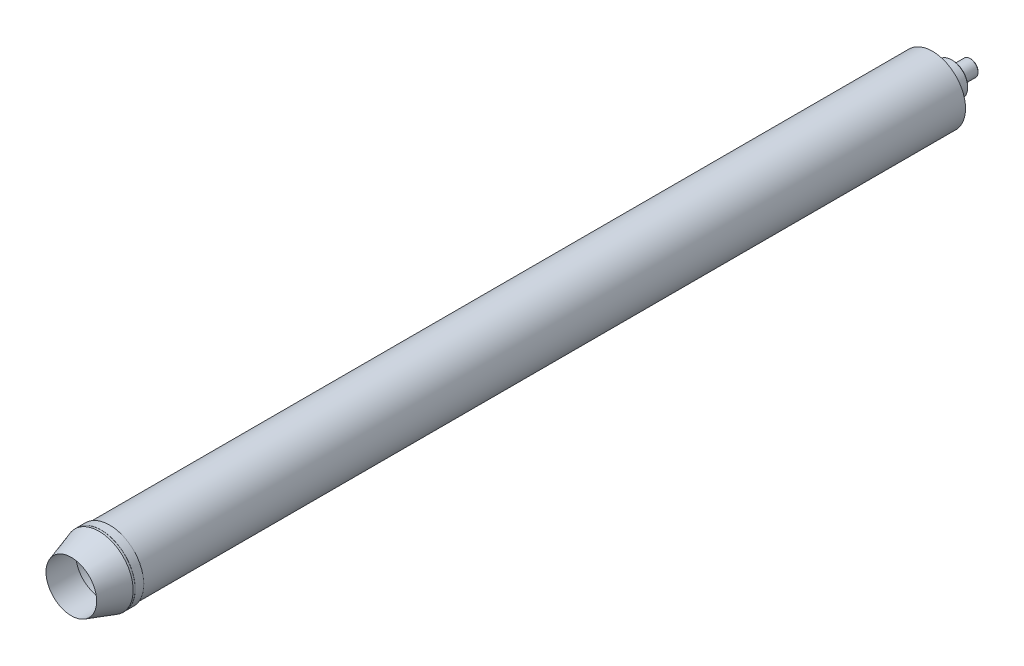
ISO-10303-21;
HEADER;
FILE_DESCRIPTION(('STEP AP214'),'2;1');
FILE_NAME('part.step','',(''),(''),'','','');
FILE_SCHEMA(('AUTOMOTIVE_DESIGN { 1 0 10303 214 1 1 1 1 }'));
ENDSEC;
DATA;
#1=APPLICATION_CONTEXT('core data for automotive mechanical design processes');
#2=APPLICATION_PROTOCOL_DEFINITION('international standard','automotive_design',2000,#1);
#3=PRODUCT_CONTEXT('',#1,'mechanical');
#4=PRODUCT('Part','Part','',(#3));
#5=PRODUCT_RELATED_PRODUCT_CATEGORY('part','',(#4));
#6=PRODUCT_DEFINITION_FORMATION('','',#4);
#7=PRODUCT_DEFINITION_CONTEXT('part definition',#1,'design');
#8=PRODUCT_DEFINITION('design','',#6,#7);
#9=PRODUCT_DEFINITION_SHAPE('','',#8);
#10=(LENGTH_UNIT() NAMED_UNIT(*) SI_UNIT(.MILLI.,.METRE.));
#11=(NAMED_UNIT(*) PLANE_ANGLE_UNIT() SI_UNIT($,.RADIAN.));
#12=(NAMED_UNIT(*) SI_UNIT($,.STERADIAN.) SOLID_ANGLE_UNIT());
#13=UNCERTAINTY_MEASURE_WITH_UNIT(LENGTH_MEASURE(1.E-05),#10,'distance_accuracy_value','');
#14=(GEOMETRIC_REPRESENTATION_CONTEXT(3) GLOBAL_UNCERTAINTY_ASSIGNED_CONTEXT((#13)) GLOBAL_UNIT_ASSIGNED_CONTEXT((#10,
#11,#12)) REPRESENTATION_CONTEXT('',''));
#15=CARTESIAN_POINT('',(0.,0.,0.));
#16=DIRECTION('',(0.,0.,1.));
#17=DIRECTION('',(1.,0.,0.));
#18=AXIS2_PLACEMENT_3D('',#15,#16,#17);
#19=CARTESIAN_POINT('',(0.,0.,-29.845));
#20=DIRECTION('',(0.,0.,-1.));
#21=DIRECTION('',(-1.,0.,0.));
#22=AXIS2_PLACEMENT_3D('',#19,#20,#21);
#23=PLANE('',#22);
#24=CARTESIAN_POINT('',(0.,0.,-29.845));
#25=DIRECTION('',(0.,0.,-1.));
#26=DIRECTION('',(-1.,0.,0.));
#27=AXIS2_PLACEMENT_3D('',#24,#25,#26);
#28=CIRCLE('',#27,22.6060000000007);
#29=CARTESIAN_POINT('',(-22.6060000000007,0.,-29.845));
#30=VERTEX_POINT('',#29);
#31=EDGE_CURVE('E87',#30,#30,#28,.T.);
#32=ORIENTED_EDGE('',*,*,#31,.T.);
#33=EDGE_LOOP('',(#32));
#34=FACE_BOUND('',#33,.T.);
#35=CARTESIAN_POINT('',(0.,0.,-29.845));
#36=DIRECTION('',(0.,0.,-1.));
#37=DIRECTION('',(-1.,0.,0.));
#38=AXIS2_PLACEMENT_3D('',#35,#36,#37);
#39=CIRCLE('',#38,11.938);
#40=CARTESIAN_POINT('',(-11.938,0.,-29.845));
#41=VERTEX_POINT('',#40);
#42=EDGE_CURVE('E56',#41,#41,#39,.T.);
#43=ORIENTED_EDGE('',*,*,#42,.F.);
#44=EDGE_LOOP('',(#43));
#45=FACE_BOUND('',#44,.T.);
#46=ADVANCED_FACE('F37',(#34,#45),#23,.T.);
#47=CARTESIAN_POINT('',(0.,0.,-29.845));
#48=DIRECTION('',(0.,0.,1.));
#49=DIRECTION('',(1.,0.,0.));
#50=AXIS2_PLACEMENT_3D('',#47,#48,#49);
#51=CYLINDRICAL_SURFACE('',#50,23.876);
#52=CARTESIAN_POINT('',(0.,0.,-28.5750000000006));
#53=DIRECTION('',(0.,0.,-1.));
#54=DIRECTION('',(-1.,0.,0.));
#55=AXIS2_PLACEMENT_3D('',#52,#53,#54);
#56=CIRCLE('',#55,23.876);
#57=CARTESIAN_POINT('',(23.876,0.,-28.5750000000006));
#58=VERTEX_POINT('',#57);
#59=EDGE_CURVE('E44',#58,#58,#56,.F.);
#60=CARTESIAN_POINT('',(0.,0.,3.175));
#61=DIRECTION('',(0.,0.,-1.));
#62=DIRECTION('',(-1.,0.,0.));
#63=AXIS2_PLACEMENT_3D('',#60,#61,#62);
#64=CIRCLE('',#63,23.876);
#65=CARTESIAN_POINT('',(23.876,0.,3.175));
#66=VERTEX_POINT('',#65);
#67=EDGE_CURVE('E378',#66,#66,#64,.T.);
#68=CARTESIAN_POINT('',(23.876,0.,-28.5750000000006));
#69=CARTESIAN_POINT('',(23.876,0.,-28.244270833334));
#70=CARTESIAN_POINT('',(23.876,0.,-27.9135416666673));
#71=CARTESIAN_POINT('',(23.876,0.,-27.2520833333339));
#72=CARTESIAN_POINT('',(23.876,0.,-26.9213541666673));
#73=CARTESIAN_POINT('',(23.876,0.,-26.2598958333339));
#74=CARTESIAN_POINT('',(23.876,0.,-25.9291666666672));
#75=CARTESIAN_POINT('',(23.876,0.,-25.2677083333339));
#76=CARTESIAN_POINT('',(23.876,0.,-24.9369791666672));
#77=CARTESIAN_POINT('',(23.876,0.,-24.2755208333339));
#78=CARTESIAN_POINT('',(23.876,0.,-23.9447916666672));
#79=CARTESIAN_POINT('',(23.876,0.,-23.2833333333339));
#80=CARTESIAN_POINT('',(23.876,0.,-22.9526041666672));
#81=CARTESIAN_POINT('',(23.876,0.,-22.2911458333338));
#82=CARTESIAN_POINT('',(23.876,0.,-21.9604166666672));
#83=CARTESIAN_POINT('',(23.876,0.,-21.2989583333338));
#84=CARTESIAN_POINT('',(23.876,0.,-20.9682291666671));
#85=CARTESIAN_POINT('',(23.876,0.,-20.3067708333338));
#86=CARTESIAN_POINT('',(23.876,0.,-19.9760416666671));
#87=CARTESIAN_POINT('',(23.876,0.,-19.3145833333338));
#88=CARTESIAN_POINT('',(23.876,0.,-18.9838541666671));
#89=CARTESIAN_POINT('',(23.876,0.,-18.3223958333338));
#90=CARTESIAN_POINT('',(23.876,0.,-17.9916666666671));
#91=CARTESIAN_POINT('',(23.876,0.,-17.3302083333337));
#92=CARTESIAN_POINT('',(23.876,0.,-16.9994791666671));
#93=CARTESIAN_POINT('',(23.876,0.,-16.3380208333337));
#94=CARTESIAN_POINT('',(23.876,0.,-16.007291666667));
#95=CARTESIAN_POINT('',(23.876,0.,-15.3458333333337));
#96=CARTESIAN_POINT('',(23.876,0.,-15.015104166667));
#97=CARTESIAN_POINT('',(23.876,0.,-14.3536458333337));
#98=CARTESIAN_POINT('',(23.876,0.,-14.022916666667));
#99=CARTESIAN_POINT('',(23.876,0.,-13.3614583333337));
#100=CARTESIAN_POINT('',(23.876,0.,-13.030729166667));
#101=CARTESIAN_POINT('',(23.876,0.,-12.3692708333336));
#102=CARTESIAN_POINT('',(23.876,0.,-12.038541666667));
#103=CARTESIAN_POINT('',(23.876,0.,-11.3770833333336));
#104=CARTESIAN_POINT('',(23.876,0.,-11.046354166667));
#105=CARTESIAN_POINT('',(23.876,0.,-10.3848958333336));
#106=CARTESIAN_POINT('',(23.876,0.,-10.0541666666669));
#107=CARTESIAN_POINT('',(23.876,0.,-9.39270833333358));
#108=CARTESIAN_POINT('',(23.876,0.,-9.06197916666691));
#109=CARTESIAN_POINT('',(23.876,0.,-8.40052083333356));
#110=CARTESIAN_POINT('',(23.876,0.,-8.06979166666689));
#111=CARTESIAN_POINT('',(23.876,0.,-7.40833333333354));
#112=CARTESIAN_POINT('',(23.876,0.,-7.07760416666687));
#113=CARTESIAN_POINT('',(23.876,0.,-6.41614583333352));
#114=CARTESIAN_POINT('',(23.876,0.,-6.08541666666685));
#115=CARTESIAN_POINT('',(23.876,0.,-5.4239583333335));
#116=CARTESIAN_POINT('',(23.876,0.,-5.09322916666683));
#117=CARTESIAN_POINT('',(23.876,0.,-4.43177083333348));
#118=CARTESIAN_POINT('',(23.876,0.,-4.10104166666681));
#119=CARTESIAN_POINT('',(23.876,0.,-3.43958333333346));
#120=CARTESIAN_POINT('',(23.876,0.,-3.10885416666679));
#121=CARTESIAN_POINT('',(23.876,0.,-2.44739583333344));
#122=CARTESIAN_POINT('',(23.876,0.,-2.11666666666677));
#123=CARTESIAN_POINT('',(23.876,0.,-1.45520833333342));
#124=CARTESIAN_POINT('',(23.876,0.,-1.12447916666675));
#125=CARTESIAN_POINT('',(23.876,0.,-0.463020833333399));
#126=CARTESIAN_POINT('',(23.876,0.,-0.132291666666726));
#127=CARTESIAN_POINT('',(23.876,0.,0.52916666666662));
#128=CARTESIAN_POINT('',(23.876,0.,0.859895833333293));
#129=CARTESIAN_POINT('',(23.876,0.,1.52135416666664));
#130=CARTESIAN_POINT('',(23.876,0.,1.85208333333331));
#131=CARTESIAN_POINT('',(23.876,0.,2.51354166666665));
#132=CARTESIAN_POINT('',(23.876,0.,2.84427083333333));
#133=CARTESIAN_POINT('',(23.876,0.,3.175));
#134=B_SPLINE_CURVE_WITH_KNOTS('',3,(#68,#69,#70,#71,#72,#73,#74,#75,#76,#77,#78,#79,#80,#81,
#82,#83,#84,#85,#86,#87,#88,#89,#90,#91,#92,#93,#94,#95,#96,#97,#98,#99,#100,#101,#102,#103,
#104,#105,#106,#107,#108,#109,#110,#111,#112,#113,#114,#115,#116,#117,#118,#119,#120,#121,#122,
#123,#124,#125,#126,#127,#128,#129,#130,#131,#132,#133),.UNSPECIFIED.,.F.,.F.,(4,2,2,2,2,2,2,2,
2,2,2,2,2,2,2,2,2,2,2,2,2,2,2,2,2,2,2,2,2,2,2,2,4),(0.,0.992187500000023,1.98437500000004,
2.97656250000006,3.96875000000008,4.9609375000001,5.95312500000012,6.94531250000014,
7.93750000000016,8.92968750000018,9.9218750000002,10.9140625000002,11.9062500000002,
12.8984375000003,13.8906250000003,14.8828125000003,15.8750000000003,16.8671875000003,
17.8593750000004,18.8515625000004,19.8437500000004,20.8359375000004,21.8281250000004,
22.8203125000005,23.8125000000005,24.8046875000005,25.7968750000005,26.7890625000005,
27.7812500000006,28.7734375000006,29.7656250000006,30.7578125000006,31.7500000000006),.UNSPECIFIED.);
#135=EDGE_CURVE('BSEAM92',#58,#66,#134,.T.);
#136=ORIENTED_EDGE('',*,*,#59,.T.);
#137=ORIENTED_EDGE('',*,*,#67,.T.);
#138=ORIENTED_EDGE('',*,*,#135,.T.);
#139=ORIENTED_EDGE('',*,*,#135,.F.);
#140=EDGE_LOOP('',(#136,#138,#137,#139));
#141=FACE_BOUND('',#140,.T.);
#142=ADVANCED_FACE('F92',(#141),#51,.T.);
#143=CARTESIAN_POINT('',(0.,0.,-57.15));
#144=DIRECTION('',(0.,0.,1.));
#145=DIRECTION('',(1.,0.,0.));
#146=AXIS2_PLACEMENT_3D('',#143,#144,#145);
#147=CYLINDRICAL_SURFACE('',#146,11.938);
#148=CARTESIAN_POINT('',(0.,0.,-55.88));
#149=DIRECTION('',(0.,0.,-1.));
#150=DIRECTION('',(-1.,0.,0.));
#151=AXIS2_PLACEMENT_3D('',#148,#149,#150);
#152=CIRCLE('',#151,11.938);
#153=CARTESIAN_POINT('',(-11.938,0.,-55.88));
#154=VERTEX_POINT('',#153);
#155=EDGE_CURVE('E84',#154,#154,#152,.F.);
#156=ORIENTED_EDGE('',*,*,#155,.T.);
#157=EDGE_LOOP('',(#156));
#158=FACE_BOUND('',#157,.T.);
#159=ORIENTED_EDGE('',*,*,#42,.T.);
#160=EDGE_LOOP('',(#159));
#161=FACE_BOUND('',#160,.T.);
#162=ADVANCED_FACE('F105',(#158,#161),#147,.T.);
#163=CARTESIAN_POINT('',(0.,0.,-57.15));
#164=DIRECTION('',(0.,0.,-1.));
#165=DIRECTION('',(-1.,0.,0.));
#166=AXIS2_PLACEMENT_3D('',#163,#164,#165);
#167=PLANE('',#166);
#168=CARTESIAN_POINT('',(0.,0.,-57.15));
#169=DIRECTION('',(0.,0.,-1.));
#170=DIRECTION('',(-1.,0.,0.));
#171=AXIS2_PLACEMENT_3D('',#168,#169,#170);
#172=CIRCLE('',#171,3.96875);
#173=CARTESIAN_POINT('',(-3.96875,0.,-57.15));
#174=VERTEX_POINT('',#173);
#175=EDGE_CURVE('E57',#174,#174,#172,.T.);
#176=ORIENTED_EDGE('',*,*,#175,.F.);
#177=EDGE_LOOP('',(#176));
#178=FACE_BOUND('',#177,.T.);
#179=CARTESIAN_POINT('',(0.,0.,-57.15));
#180=DIRECTION('',(0.,0.,-1.));
#181=DIRECTION('',(-1.,0.,0.));
#182=AXIS2_PLACEMENT_3D('',#179,#180,#181);
#183=CIRCLE('',#182,10.6679999999999);
#184=CARTESIAN_POINT('',(-10.6679999999999,0.,-57.15));
#185=VERTEX_POINT('',#184);
#186=EDGE_CURVE('E81',#185,#185,#183,.T.);
#187=ORIENTED_EDGE('',*,*,#186,.T.);
#188=EDGE_LOOP('',(#187));
#189=FACE_BOUND('',#188,.T.);
#190=ADVANCED_FACE('F107',(#178,#189),#167,.T.);
#191=CARTESIAN_POINT('',(0.,0.,-57.15));
#192=DIRECTION('',(0.,0.,1.));
#193=DIRECTION('',(1.,0.,0.));
#194=AXIS2_PLACEMENT_3D('',#191,#192,#193);
#195=CONICAL_SURFACE('',#194,10.6679999999999,0.785398163397468);
#196=ORIENTED_EDGE('',*,*,#155,.F.);
#197=EDGE_LOOP('',(#196));
#198=FACE_BOUND('',#197,.T.);
#199=ORIENTED_EDGE('',*,*,#186,.F.);
#200=EDGE_LOOP('',(#199));
#201=FACE_BOUND('',#200,.T.);
#202=ADVANCED_FACE('F97',(#198,#201),#195,.T.);
#203=CARTESIAN_POINT('',(0.,0.,-29.845));
#204=DIRECTION('',(0.,0.,1.));
#205=DIRECTION('',(1.,0.,0.));
#206=AXIS2_PLACEMENT_3D('',#203,#204,#205);
#207=CONICAL_SURFACE('',#206,22.6060000000007,0.785398163397431);
#208=ORIENTED_EDGE('',*,*,#59,.F.);
#209=EDGE_LOOP('',(#208));
#210=FACE_BOUND('',#209,.T.);
#211=ORIENTED_EDGE('',*,*,#31,.F.);
#212=EDGE_LOOP('',(#211));
#213=FACE_BOUND('',#212,.T.);
#214=ADVANCED_FACE('F39',(#210,#213),#207,.T.);
#215=CARTESIAN_POINT('',(0.,0.,-30.1625));
#216=DIRECTION('',(0.,0.,-1.));
#217=DIRECTION('',(-1.,0.,0.));
#218=AXIS2_PLACEMENT_3D('',#215,#216,#217);
#219=CONICAL_SURFACE('',#218,3.96875,1.02974425867665);
#220=CARTESIAN_POINT('',(0.,0.,-27.7778344182344));
#221=VERTEX_POINT('',#220);
#222=VERTEX_LOOP('',#221);
#223=FACE_BOUND('',#222,.T.);
#224=CARTESIAN_POINT('',(0.,0.,-30.1625));
#225=DIRECTION('',(0.,0.,-1.));
#226=DIRECTION('',(-1.,0.,0.));
#227=AXIS2_PLACEMENT_3D('',#224,#225,#226);
#228=CIRCLE('',#227,3.96875);
#229=CARTESIAN_POINT('',(-3.96875,0.,-30.1625));
#230=VERTEX_POINT('',#229);
#231=EDGE_CURVE('E54',#230,#230,#228,.T.);
#232=ORIENTED_EDGE('',*,*,#231,.T.);
#233=EDGE_LOOP('',(#232));
#234=FACE_BOUND('',#233,.T.);
#235=ADVANCED_FACE('F47',(#223,#234),#219,.F.);
#236=CARTESIAN_POINT('',(0.,0.,-57.15));
#237=DIRECTION('',(0.,0.,-1.));
#238=DIRECTION('',(-1.,0.,0.));
#239=AXIS2_PLACEMENT_3D('',#236,#237,#238);
#240=CYLINDRICAL_SURFACE('',#239,3.96875);
#241=ORIENTED_EDGE('',*,*,#231,.F.);
#242=EDGE_LOOP('',(#241));
#243=FACE_BOUND('',#242,.T.);
#244=ORIENTED_EDGE('',*,*,#175,.T.);
#245=EDGE_LOOP('',(#244));
#246=FACE_BOUND('',#245,.T.);
#247=ADVANCED_FACE('F50',(#243,#246),#240,.F.);
#248=CARTESIAN_POINT('',(0.,0.,3.175));
#249=DIRECTION('',(0.,0.,-1.));
#250=DIRECTION('',(-1.,0.,0.));
#251=AXIS2_PLACEMENT_3D('',#248,#249,#250);
#252=CYLINDRICAL_SURFACE('',#251,46.0375);
#253=CARTESIAN_POINT('',(0.,0.,3.175));
#254=DIRECTION('',(0.,0.,-1.));
#255=DIRECTION('',(-1.,0.,0.));
#256=AXIS2_PLACEMENT_3D('',#253,#254,#255);
#257=CIRCLE('',#256,46.0375);
#258=CARTESIAN_POINT('',(-46.0375,0.,3.175));
#259=VERTEX_POINT('',#258);
#260=EDGE_CURVE('E63',#259,#259,#257,.T.);
#261=ORIENTED_EDGE('',*,*,#260,.F.);
#262=EDGE_LOOP('',(#261));
#263=FACE_BOUND('',#262,.T.);
#264=CARTESIAN_POINT('',(0.,0.,0.));
#265=DIRECTION('',(0.,0.,-1.));
#266=DIRECTION('',(-1.,0.,0.));
#267=AXIS2_PLACEMENT_3D('',#264,#265,#266);
#268=CIRCLE('',#267,46.0375);
#269=CARTESIAN_POINT('',(-46.0375,0.,0.));
#270=VERTEX_POINT('',#269);
#271=EDGE_CURVE('E381',#270,#270,#268,.T.);
#272=ORIENTED_EDGE('',*,*,#271,.T.);
#273=EDGE_LOOP('',(#272));
#274=FACE_BOUND('',#273,.T.);
#275=ADVANCED_FACE('F176',(#263,#274),#252,.F.);
#276=CARTESIAN_POINT('',(0.,0.,3.175));
#277=DIRECTION('',(0.,0.,-1.));
#278=DIRECTION('',(-1.,0.,0.));
#279=AXIS2_PLACEMENT_3D('',#276,#277,#278);
#280=PLANE('',#279);
#281=ORIENTED_EDGE('',*,*,#67,.F.);
#282=EDGE_LOOP('',(#281));
#283=FACE_BOUND('',#282,.T.);
#284=ORIENTED_EDGE('',*,*,#260,.T.);
#285=EDGE_LOOP('',(#284));
#286=FACE_BOUND('',#285,.T.);
#287=ADVANCED_FACE('F128',(#283,#286),#280,.T.);
#288=CARTESIAN_POINT('',(0.,0.,1238.504));
#289=DIRECTION('',(0.,0.,1.));
#290=DIRECTION('',(1.,0.,0.));
#291=AXIS2_PLACEMENT_3D('',#288,#289,#290);
#292=PLANE('',#291);
#293=CARTESIAN_POINT('',(0.,0.,1238.504));
#294=DIRECTION('',(0.,0.,1.));
#295=DIRECTION('',(1.,0.,0.));
#296=AXIS2_PLACEMENT_3D('',#293,#294,#295);
#297=CIRCLE('',#296,50.546);
#298=CARTESIAN_POINT('',(50.546,0.,1238.504));
#299=VERTEX_POINT('',#298);
#300=EDGE_CURVE('E11',#299,#299,#297,.T.);
#301=ORIENTED_EDGE('',*,*,#300,.F.);
#302=EDGE_LOOP('',(#301));
#303=FACE_BOUND('',#302,.T.);
#304=CARTESIAN_POINT('',(0.,0.,1238.504));
#305=DIRECTION('',(0.,0.,1.));
#306=DIRECTION('',(1.,0.,0.));
#307=AXIS2_PLACEMENT_3D('',#304,#305,#306);
#308=CIRCLE('',#307,50.8);
#309=CARTESIAN_POINT('',(50.8,0.,1238.504));
#310=VERTEX_POINT('',#309);
#311=EDGE_CURVE('E67',#310,#310,#308,.T.);
#312=ORIENTED_EDGE('',*,*,#311,.T.);
#313=EDGE_LOOP('',(#312));
#314=FACE_BOUND('',#313,.T.);
#315=ADVANCED_FACE('F124',(#303,#314),#292,.T.);
#316=CARTESIAN_POINT('',(0.,0.,1238.504));
#317=DIRECTION('',(0.,0.,-1.));
#318=DIRECTION('',(-1.,0.,0.));
#319=AXIS2_PLACEMENT_3D('',#316,#317,#318);
#320=CYLINDRICAL_SURFACE('',#319,50.8);
#321=ORIENTED_EDGE('',*,*,#311,.F.);
#322=EDGE_LOOP('',(#321));
#323=FACE_BOUND('',#322,.T.);
#324=CARTESIAN_POINT('',(0.,0.,1225.804));
#325=DIRECTION('',(0.,0.,1.));
#326=DIRECTION('',(1.,0.,0.));
#327=AXIS2_PLACEMENT_3D('',#324,#325,#326);
#328=CIRCLE('',#327,50.8);
#329=CARTESIAN_POINT('',(50.8,0.,1225.804));
#330=VERTEX_POINT('',#329);
#331=EDGE_CURVE('E60',#330,#330,#328,.T.);
#332=ORIENTED_EDGE('',*,*,#331,.T.);
#333=EDGE_LOOP('',(#332));
#334=FACE_BOUND('',#333,.T.);
#335=ADVANCED_FACE('F127',(#323,#334),#320,.T.);
#336=CARTESIAN_POINT('',(0.,0.,1225.804));
#337=DIRECTION('',(0.,0.,1.));
#338=DIRECTION('',(1.,0.,0.));
#339=AXIS2_PLACEMENT_3D('',#336,#337,#338);
#340=PLANE('',#339);
#341=ORIENTED_EDGE('',*,*,#331,.F.);
#342=EDGE_LOOP('',(#341));
#343=FACE_BOUND('',#342,.T.);
#344=CARTESIAN_POINT('',(0.,0.,1225.804));
#345=DIRECTION('',(0.,0.,1.));
#346=DIRECTION('',(1.,0.,0.));
#347=AXIS2_PLACEMENT_3D('',#344,#345,#346);
#348=CIRCLE('',#347,49.2125);
#349=CARTESIAN_POINT('',(49.2125,0.,1225.804));
#350=VERTEX_POINT('',#349);
#351=EDGE_CURVE('E73',#350,#350,#348,.T.);
#352=ORIENTED_EDGE('',*,*,#351,.T.);
#353=EDGE_LOOP('',(#352));
#354=FACE_BOUND('',#353,.T.);
#355=ADVANCED_FACE('F130',(#343,#354),#340,.F.);
#356=CARTESIAN_POINT('',(0.,0.,1225.804));
#357=DIRECTION('',(0.,0.,-1.));
#358=DIRECTION('',(-1.,0.,0.));
#359=AXIS2_PLACEMENT_3D('',#356,#357,#358);
#360=CYLINDRICAL_SURFACE('',#359,49.2125);
#361=ORIENTED_EDGE('',*,*,#351,.F.);
#362=EDGE_LOOP('',(#361));
#363=FACE_BOUND('',#362,.T.);
#364=CARTESIAN_POINT('',(0.,0.,0.));
#365=DIRECTION('',(0.,0.,1.));
#366=DIRECTION('',(1.,0.,0.));
#367=AXIS2_PLACEMENT_3D('',#364,#365,#366);
#368=CIRCLE('',#367,49.2125);
#369=CARTESIAN_POINT('',(49.2125,0.,0.));
#370=VERTEX_POINT('',#369);
#371=EDGE_CURVE('E70',#370,#370,#368,.T.);
#372=ORIENTED_EDGE('',*,*,#371,.T.);
#373=EDGE_LOOP('',(#372));
#374=FACE_BOUND('',#373,.T.);
#375=ADVANCED_FACE('F133',(#363,#374),#360,.T.);
#376=CARTESIAN_POINT('',(0.,0.,0.));
#377=DIRECTION('',(0.,0.,1.));
#378=DIRECTION('',(1.,0.,0.));
#379=AXIS2_PLACEMENT_3D('',#376,#377,#378);
#380=PLANE('',#379);
#381=ORIENTED_EDGE('',*,*,#271,.F.);
#382=EDGE_LOOP('',(#381));
#383=FACE_BOUND('',#382,.T.);
#384=ORIENTED_EDGE('',*,*,#371,.F.);
#385=EDGE_LOOP('',(#384));
#386=FACE_BOUND('',#385,.T.);
#387=ADVANCED_FACE('F141',(#383,#386),#380,.F.);
#388=CARTESIAN_POINT('',(0.,0.,1241.679));
#389=DIRECTION('',(0.,0.,-1.));
#390=DIRECTION('',(-1.,0.,0.));
#391=AXIS2_PLACEMENT_3D('',#388,#389,#390);
#392=CONICAL_SURFACE('',#391,50.8,0.306909343585375);
#393=CARTESIAN_POINT('',(0.,0.,1282.954));
#394=DIRECTION('',(0.,0.,-1.));
#395=DIRECTION('',(-1.,0.,0.));
#396=AXIS2_PLACEMENT_3D('',#393,#394,#395);
#397=CIRCLE('',#396,37.719);
#398=CARTESIAN_POINT('',(-37.719,0.,1282.954));
#399=VERTEX_POINT('',#398);
#400=EDGE_CURVE('E362',#399,#399,#397,.T.);
#401=ORIENTED_EDGE('',*,*,#400,.T.);
#402=EDGE_LOOP('',(#401));
#403=FACE_BOUND('',#402,.T.);
#404=CARTESIAN_POINT('',(0.,0.,1241.679));
#405=DIRECTION('',(0.,0.,-1.));
#406=DIRECTION('',(-1.,0.,0.));
#407=AXIS2_PLACEMENT_3D('',#404,#405,#406);
#408=CIRCLE('',#407,50.8);
#409=CARTESIAN_POINT('',(-50.8,0.,1241.679));
#410=VERTEX_POINT('',#409);
#411=EDGE_CURVE('E372',#410,#410,#408,.T.);
#412=ORIENTED_EDGE('',*,*,#411,.F.);
#413=EDGE_LOOP('',(#412));
#414=FACE_BOUND('',#413,.T.);
#415=ADVANCED_FACE('F144',(#403,#414),#392,.T.);
#416=CARTESIAN_POINT('',(0.,0.,1238.504));
#417=DIRECTION('',(0.,0.,-1.));
#418=DIRECTION('',(-1.,0.,0.));
#419=AXIS2_PLACEMENT_3D('',#416,#417,#418);
#420=CYLINDRICAL_SURFACE('',#419,50.8);
#421=ORIENTED_EDGE('',*,*,#411,.T.);
#422=EDGE_LOOP('',(#421));
#423=FACE_BOUND('',#422,.T.);
#424=CARTESIAN_POINT('',(0.,0.,1238.758));
#425=DIRECTION('',(0.,0.,-1.));
#426=DIRECTION('',(-1.,0.,0.));
#427=AXIS2_PLACEMENT_3D('',#424,#425,#426);
#428=CIRCLE('',#427,50.8);
#429=CARTESIAN_POINT('',(-50.8,0.,1238.758));
#430=VERTEX_POINT('',#429);
#431=EDGE_CURVE('E369',#430,#430,#428,.T.);
#432=ORIENTED_EDGE('',*,*,#431,.F.);
#433=EDGE_LOOP('',(#432));
#434=FACE_BOUND('',#433,.T.);
#435=ADVANCED_FACE('F218',(#423,#434),#420,.T.);
#436=CARTESIAN_POINT('',(-50.546,0.,1238.758));
#437=DIRECTION('',(0.,0.,-1.));
#438=DIRECTION('',(-1.,0.,0.));
#439=AXIS2_PLACEMENT_3D('',#436,#437,#438);
#440=PLANE('',#439);
#441=ORIENTED_EDGE('',*,*,#431,.T.);
#442=EDGE_LOOP('',(#441));
#443=FACE_BOUND('',#442,.T.);
#444=CARTESIAN_POINT('',(0.,0.,1238.758));
#445=DIRECTION('',(0.,0.,-1.));
#446=DIRECTION('',(-1.,0.,0.));
#447=AXIS2_PLACEMENT_3D('',#444,#445,#446);
#448=CIRCLE('',#447,50.546);
#449=CARTESIAN_POINT('',(-50.546,0.,1238.758));
#450=VERTEX_POINT('',#449);
#451=EDGE_CURVE('E364',#450,#450,#448,.T.);
#452=ORIENTED_EDGE('',*,*,#451,.F.);
#453=EDGE_LOOP('',(#452));
#454=FACE_BOUND('',#453,.T.);
#455=ADVANCED_FACE('F226',(#443,#454),#440,.T.);
#456=CARTESIAN_POINT('',(0.,0.,1238.504));
#457=DIRECTION('',(0.,0.,-1.));
#458=DIRECTION('',(-1.,0.,0.));
#459=AXIS2_PLACEMENT_3D('',#456,#457,#458);
#460=CYLINDRICAL_SURFACE('',#459,50.546);
#461=ORIENTED_EDGE('',*,*,#451,.T.);
#462=EDGE_LOOP('',(#461));
#463=FACE_BOUND('',#462,.T.);
#464=ORIENTED_EDGE('',*,*,#300,.T.);
#465=EDGE_LOOP('',(#464));
#466=FACE_BOUND('',#465,.T.);
#467=ADVANCED_FACE('F234',(#463,#466),#460,.T.);
#468=CARTESIAN_POINT('',(-37.719,0.,1238.504));
#469=DIRECTION('',(0.,0.,-1.));
#470=DIRECTION('',(-1.,0.,0.));
#471=AXIS2_PLACEMENT_3D('',#468,#469,#470);
#472=PLANE('',#471);
#473=CARTESIAN_POINT('',(0.,0.,1238.504));
#474=DIRECTION('',(0.,0.,-1.));
#475=DIRECTION('',(-1.,0.,0.));
#476=AXIS2_PLACEMENT_3D('',#473,#474,#475);
#477=CIRCLE('',#476,47.625);
#478=CARTESIAN_POINT('',(-47.625,0.,1238.504));
#479=VERTEX_POINT('',#478);
#480=EDGE_CURVE('E375',#479,#479,#477,.T.);
#481=ORIENTED_EDGE('',*,*,#480,.T.);
#482=EDGE_LOOP('',(#481));
#483=FACE_BOUND('',#482,.T.);
#484=CARTESIAN_POINT('',(0.,0.,1238.504));
#485=DIRECTION('',(0.,0.,-1.));
#486=DIRECTION('',(-1.,0.,0.));
#487=AXIS2_PLACEMENT_3D('',#484,#485,#486);
#488=CIRCLE('',#487,37.719);
#489=CARTESIAN_POINT('',(-37.719,0.,1238.504));
#490=VERTEX_POINT('',#489);
#491=EDGE_CURVE('E359',#490,#490,#488,.T.);
#492=ORIENTED_EDGE('',*,*,#491,.F.);
#493=EDGE_LOOP('',(#492));
#494=FACE_BOUND('',#493,.T.);
#495=ADVANCED_FACE('F242',(#483,#494),#472,.T.);
#496=CARTESIAN_POINT('',(0.,0.,1238.504));
#497=DIRECTION('',(0.,0.,-1.));
#498=DIRECTION('',(-1.,0.,0.));
#499=AXIS2_PLACEMENT_3D('',#496,#497,#498);
#500=CYLINDRICAL_SURFACE('',#499,37.719);
#501=ORIENTED_EDGE('',*,*,#491,.T.);
#502=EDGE_LOOP('',(#501));
#503=FACE_BOUND('',#502,.T.);
#504=ORIENTED_EDGE('',*,*,#400,.F.);
#505=EDGE_LOOP('',(#504));
#506=FACE_BOUND('',#505,.T.);
#507=ADVANCED_FACE('F122',(#503,#506),#500,.F.);
#508=CARTESIAN_POINT('',(0.,0.,6.35));
#509=DIRECTION('',(0.,0.,1.));
#510=DIRECTION('',(1.,0.,0.));
#511=AXIS2_PLACEMENT_3D('',#508,#509,#510);
#512=PLANE('',#511);
#513=CARTESIAN_POINT('',(0.,0.,6.35000000000008));
#514=DIRECTION('',(0.,0.,1.));
#515=DIRECTION('',(1.,0.,0.));
#516=AXIS2_PLACEMENT_3D('',#513,#514,#515);
#517=CIRCLE('',#516,47.625);
#518=CARTESIAN_POINT('',(47.625,0.,6.35000000000008));
#519=VERTEX_POINT('',#518);
#520=EDGE_CURVE('E76',#519,#519,#517,.T.);
#521=ORIENTED_EDGE('',*,*,#520,.T.);
#522=EDGE_LOOP('',(#521));
#523=FACE_BOUND('',#522,.T.);
#524=ADVANCED_FACE('F118',(#523),#512,.T.);
#525=CARTESIAN_POINT('',(0.,0.,1225.804));
#526=DIRECTION('',(0.,0.,-1.));
#527=DIRECTION('',(-1.,0.,0.));
#528=AXIS2_PLACEMENT_3D('',#525,#526,#527);
#529=CYLINDRICAL_SURFACE('',#528,47.625);
#530=ORIENTED_EDGE('',*,*,#520,.F.);
#531=EDGE_LOOP('',(#530));
#532=FACE_BOUND('',#531,.T.);
#533=ORIENTED_EDGE('',*,*,#480,.F.);
#534=EDGE_LOOP('',(#533));
#535=FACE_BOUND('',#534,.T.);
#536=ADVANCED_FACE('F121',(#532,#535),#529,.F.);
#537=CLOSED_SHELL('',(#46,#142,#162,#190,#202,#214,#235,#247,#275,#287,#315,#335,#355,#375,#387,
#415,#435,#455,#467,#495,#507,#524,#536));
#538=MANIFOLD_SOLID_BREP('B2',#537);
#539=ADVANCED_BREP_SHAPE_REPRESENTATION('',(#18,#538),#14);
#540=SHAPE_DEFINITION_REPRESENTATION(#9,#539);
ENDSEC;
END-ISO-10303-21;
